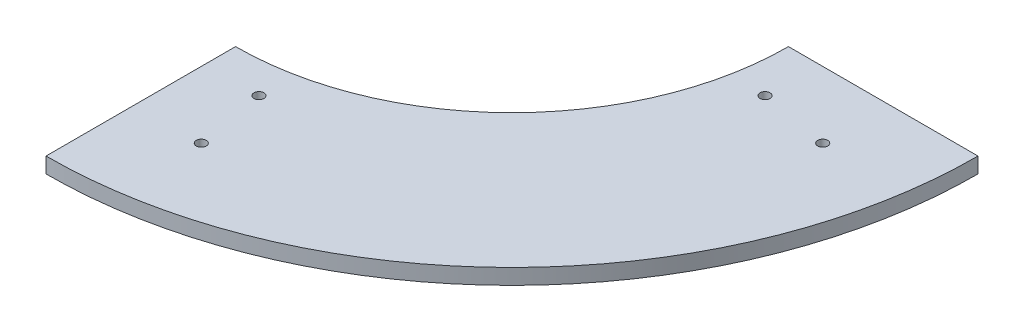
ISO-10303-21;
HEADER;
FILE_DESCRIPTION(('STEP AP214'),'2;1');
FILE_NAME('part.step','',(''),(''),'','','');
FILE_SCHEMA(('AUTOMOTIVE_DESIGN { 1 0 10303 214 1 1 1 1 }'));
ENDSEC;
DATA;
#1=APPLICATION_CONTEXT('core data for automotive mechanical design processes');
#2=APPLICATION_PROTOCOL_DEFINITION('international standard','automotive_design',2000,#1);
#3=PRODUCT_CONTEXT('',#1,'mechanical');
#4=PRODUCT('Part','Part','',(#3));
#5=PRODUCT_RELATED_PRODUCT_CATEGORY('part','',(#4));
#6=PRODUCT_DEFINITION_FORMATION('','',#4);
#7=PRODUCT_DEFINITION_CONTEXT('part definition',#1,'design');
#8=PRODUCT_DEFINITION('design','',#6,#7);
#9=PRODUCT_DEFINITION_SHAPE('','',#8);
#10=(LENGTH_UNIT() NAMED_UNIT(*) SI_UNIT(.MILLI.,.METRE.));
#11=(NAMED_UNIT(*) PLANE_ANGLE_UNIT() SI_UNIT($,.RADIAN.));
#12=(NAMED_UNIT(*) SI_UNIT($,.STERADIAN.) SOLID_ANGLE_UNIT());
#13=UNCERTAINTY_MEASURE_WITH_UNIT(LENGTH_MEASURE(1.E-05),#10,'distance_accuracy_value','');
#14=(GEOMETRIC_REPRESENTATION_CONTEXT(3) GLOBAL_UNCERTAINTY_ASSIGNED_CONTEXT((#13)) GLOBAL_UNIT_ASSIGNED_CONTEXT((#10,
#11,#12)) REPRESENTATION_CONTEXT('',''));
#15=CARTESIAN_POINT('',(0.,0.,0.));
#16=DIRECTION('',(0.,0.,1.));
#17=DIRECTION('',(1.,0.,0.));
#18=AXIS2_PLACEMENT_3D('',#15,#16,#17);
#19=CARTESIAN_POINT('',(0.,6.25,0.));
#20=DIRECTION('',(0.,-1.,0.));
#21=DIRECTION('',(0.,0.,-1.));
#22=AXIS2_PLACEMENT_3D('',#19,#20,#21);
#23=CYLINDRICAL_SURFACE('',#22,111.125);
#24=CARTESIAN_POINT('',(0.,0.,0.));
#25=DIRECTION('',(0.,-1.,0.));
#26=DIRECTION('',(0.,0.,1.));
#27=AXIS2_PLACEMENT_3D('',#24,#25,#26);
#28=CIRCLE('',#27,111.125);
#29=CARTESIAN_POINT('',(111.125,0.,0.));
#30=VERTEX_POINT('',#29);
#31=CARTESIAN_POINT('',(0.,0.,111.125));
#32=VERTEX_POINT('',#31);
#33=EDGE_CURVE('E109',#30,#32,#28,.T.);
#34=ORIENTED_EDGE('',*,*,#33,.T.);
#35=DIRECTION('',(0.,-1.,0.));
#36=VECTOR('',#35,1.);
#37=CARTESIAN_POINT('',(0.,6.25,111.125));
#38=LINE('',#37,#36);
#39=CARTESIAN_POINT('',(0.,6.25,111.125));
#40=VERTEX_POINT('',#39);
#41=EDGE_CURVE('E11',#40,#32,#38,.T.);
#42=ORIENTED_EDGE('',*,*,#41,.F.);
#43=CARTESIAN_POINT('',(0.,6.25,0.));
#44=DIRECTION('',(0.,-1.,0.));
#45=DIRECTION('',(0.,0.,1.));
#46=AXIS2_PLACEMENT_3D('',#43,#44,#45);
#47=CIRCLE('',#46,111.125);
#48=CARTESIAN_POINT('',(111.125,6.25,0.));
#49=VERTEX_POINT('',#48);
#50=EDGE_CURVE('E92',#49,#40,#47,.T.);
#51=ORIENTED_EDGE('',*,*,#50,.F.);
#52=DIRECTION('',(0.,-1.,0.));
#53=VECTOR('',#52,1.);
#54=CARTESIAN_POINT('',(111.125,6.25,0.));
#55=LINE('',#54,#53);
#56=EDGE_CURVE('E105',#49,#30,#55,.T.);
#57=ORIENTED_EDGE('',*,*,#56,.T.);
#58=EDGE_LOOP('',(#34,#42,#51,#57));
#59=FACE_BOUND('',#58,.T.);
#60=ADVANCED_FACE('F38',(#59),#23,.F.);
#61=CARTESIAN_POINT('',(0.,6.25,111.125));
#62=DIRECTION('',(1.,0.,0.));
#63=DIRECTION('',(0.,0.,-1.));
#64=AXIS2_PLACEMENT_3D('',#61,#62,#63);
#65=PLANE('',#64);
#66=DIRECTION('',(0.,0.,1.));
#67=VECTOR('',#66,1.);
#68=CARTESIAN_POINT('',(0.,0.,111.125));
#69=LINE('',#68,#67);
#70=CARTESIAN_POINT('',(0.,0.,187.325));
#71=VERTEX_POINT('',#70);
#72=EDGE_CURVE('E97',#32,#71,#69,.T.);
#73=ORIENTED_EDGE('',*,*,#72,.T.);
#74=DIRECTION('',(0.,-1.,0.));
#75=VECTOR('',#74,1.);
#76=CARTESIAN_POINT('',(0.,6.25,187.325));
#77=LINE('',#76,#75);
#78=CARTESIAN_POINT('',(0.,6.25,187.325));
#79=VERTEX_POINT('',#78);
#80=EDGE_CURVE('E48',#79,#71,#77,.T.);
#81=ORIENTED_EDGE('',*,*,#80,.F.);
#82=DIRECTION('',(0.,0.,1.));
#83=VECTOR('',#82,1.);
#84=CARTESIAN_POINT('',(0.,6.25,111.125));
#85=LINE('',#84,#83);
#86=EDGE_CURVE('E87',#40,#79,#85,.T.);
#87=ORIENTED_EDGE('',*,*,#86,.F.);
#88=ORIENTED_EDGE('',*,*,#41,.T.);
#89=EDGE_LOOP('',(#73,#81,#87,#88));
#90=FACE_BOUND('',#89,.T.);
#91=ADVANCED_FACE('F96',(#90),#65,.F.);
#92=CARTESIAN_POINT('',(0.,6.25,0.));
#93=DIRECTION('',(0.,-1.,0.));
#94=DIRECTION('',(0.,0.,-1.));
#95=AXIS2_PLACEMENT_3D('',#92,#93,#94);
#96=CYLINDRICAL_SURFACE('',#95,187.325);
#97=CARTESIAN_POINT('',(0.,0.,0.));
#98=DIRECTION('',(0.,1.,0.));
#99=DIRECTION('',(0.,0.,1.));
#100=AXIS2_PLACEMENT_3D('',#97,#98,#99);
#101=CIRCLE('',#100,187.325);
#102=CARTESIAN_POINT('',(187.325,0.,0.));
#103=VERTEX_POINT('',#102);
#104=EDGE_CURVE('E74',#71,#103,#101,.T.);
#105=ORIENTED_EDGE('',*,*,#104,.T.);
#106=DIRECTION('',(0.,-1.,0.));
#107=VECTOR('',#106,1.);
#108=CARTESIAN_POINT('',(187.325,6.25,0.));
#109=LINE('',#108,#107);
#110=CARTESIAN_POINT('',(187.325,6.25,0.));
#111=VERTEX_POINT('',#110);
#112=EDGE_CURVE('E99',#111,#103,#109,.T.);
#113=ORIENTED_EDGE('',*,*,#112,.F.);
#114=CARTESIAN_POINT('',(0.,6.25,0.));
#115=DIRECTION('',(0.,1.,0.));
#116=DIRECTION('',(0.,0.,1.));
#117=AXIS2_PLACEMENT_3D('',#114,#115,#116);
#118=CIRCLE('',#117,187.325);
#119=EDGE_CURVE('E90',#79,#111,#118,.T.);
#120=ORIENTED_EDGE('',*,*,#119,.F.);
#121=ORIENTED_EDGE('',*,*,#80,.T.);
#122=EDGE_LOOP('',(#105,#113,#120,#121));
#123=FACE_BOUND('',#122,.T.);
#124=ADVANCED_FACE('F101',(#123),#96,.T.);
#125=CARTESIAN_POINT('',(111.125,6.25,0.));
#126=DIRECTION('',(0.,0.,1.));
#127=DIRECTION('',(1.,0.,0.));
#128=AXIS2_PLACEMENT_3D('',#125,#126,#127);
#129=PLANE('',#128);
#130=DIRECTION('',(-1.,0.,0.));
#131=VECTOR('',#130,1.);
#132=CARTESIAN_POINT('',(111.125,0.,0.));
#133=LINE('',#132,#131);
#134=EDGE_CURVE('E80',#103,#30,#133,.T.);
#135=ORIENTED_EDGE('',*,*,#134,.T.);
#136=ORIENTED_EDGE('',*,*,#56,.F.);
#137=DIRECTION('',(-1.,0.,0.));
#138=VECTOR('',#137,1.);
#139=CARTESIAN_POINT('',(111.125,6.25,0.));
#140=LINE('',#139,#138);
#141=EDGE_CURVE('E57',#111,#49,#140,.T.);
#142=ORIENTED_EDGE('',*,*,#141,.F.);
#143=ORIENTED_EDGE('',*,*,#112,.T.);
#144=EDGE_LOOP('',(#135,#136,#142,#143));
#145=FACE_BOUND('',#144,.T.);
#146=ADVANCED_FACE('F171',(#145),#129,.F.);
#147=CARTESIAN_POINT('',(0.,6.25,0.));
#148=DIRECTION('',(0.,1.,0.));
#149=DIRECTION('',(0.,0.,1.));
#150=AXIS2_PLACEMENT_3D('',#147,#148,#149);
#151=PLANE('',#150);
#152=CARTESIAN_POINT('',(21.777652081654,6.25,123.507202324644));
#153=DIRECTION('',(0.,1.,0.));
#154=DIRECTION('',(0.,0.,1.));
#155=AXIS2_PLACEMENT_3D('',#152,#153,#154);
#156=CIRCLE('',#155,2.);
#157=CARTESIAN_POINT('',(21.777652081654,6.25,125.507202324644));
#158=VERTEX_POINT('',#157);
#159=EDGE_CURVE('E128',#158,#158,#156,.T.);
#160=ORIENTED_EDGE('',*,*,#159,.F.);
#161=EDGE_LOOP('',(#160));
#162=FACE_BOUND('',#161,.T.);
#163=CARTESIAN_POINT('',(123.507202324644,6.25,21.7776520816541));
#164=DIRECTION('',(0.,1.,0.));
#165=DIRECTION('',(0.,0.,-1.));
#166=AXIS2_PLACEMENT_3D('',#163,#164,#165);
#167=CIRCLE('',#166,2.);
#168=CARTESIAN_POINT('',(123.507202324644,6.25,19.7776520816541));
#169=VERTEX_POINT('',#168);
#170=EDGE_CURVE('E233',#169,#169,#167,.T.);
#171=ORIENTED_EDGE('',*,*,#170,.F.);
#172=EDGE_LOOP('',(#171));
#173=FACE_BOUND('',#172,.T.);
#174=CARTESIAN_POINT('',(26.7396487584866,6.25,151.648083866967));
#175=DIRECTION('',(0.,1.,0.));
#176=DIRECTION('',(0.,0.,1.));
#177=AXIS2_PLACEMENT_3D('',#174,#175,#176);
#178=CIRCLE('',#177,2.);
#179=CARTESIAN_POINT('',(26.7396487584866,6.25,153.648083866967));
#180=VERTEX_POINT('',#179);
#181=EDGE_CURVE('E225',#180,#180,#178,.T.);
#182=ORIENTED_EDGE('',*,*,#181,.F.);
#183=EDGE_LOOP('',(#182));
#184=FACE_BOUND('',#183,.T.);
#185=CARTESIAN_POINT('',(151.648083866967,6.25,26.7396487584867));
#186=DIRECTION('',(0.,1.,0.));
#187=DIRECTION('',(0.,0.,-1.));
#188=AXIS2_PLACEMENT_3D('',#185,#186,#187);
#189=CIRCLE('',#188,2.);
#190=CARTESIAN_POINT('',(151.648083866967,6.25,24.7396487584867));
#191=VERTEX_POINT('',#190);
#192=EDGE_CURVE('E234',#191,#191,#189,.T.);
#193=ORIENTED_EDGE('',*,*,#192,.F.);
#194=EDGE_LOOP('',(#193));
#195=FACE_BOUND('',#194,.T.);
#196=ORIENTED_EDGE('',*,*,#50,.T.);
#197=ORIENTED_EDGE('',*,*,#86,.T.);
#198=ORIENTED_EDGE('',*,*,#119,.T.);
#199=ORIENTED_EDGE('',*,*,#141,.T.);
#200=EDGE_LOOP('',(#196,#197,#198,#199));
#201=FACE_BOUND('',#200,.T.);
#202=ADVANCED_FACE('F88',(#162,#173,#184,#195,#201),#151,.T.);
#203=CARTESIAN_POINT('',(0.,0.,0.));
#204=DIRECTION('',(0.,1.,0.));
#205=DIRECTION('',(0.,0.,1.));
#206=AXIS2_PLACEMENT_3D('',#203,#204,#205);
#207=PLANE('',#206);
#208=CARTESIAN_POINT('',(21.777652081654,0.,123.507202324644));
#209=DIRECTION('',(0.,1.,0.));
#210=DIRECTION('',(0.,0.,1.));
#211=AXIS2_PLACEMENT_3D('',#208,#209,#210);
#212=CIRCLE('',#211,2.);
#213=CARTESIAN_POINT('',(21.777652081654,0.,125.507202324644));
#214=VERTEX_POINT('',#213);
#215=EDGE_CURVE('E41',#214,#214,#212,.T.);
#216=ORIENTED_EDGE('',*,*,#215,.T.);
#217=EDGE_LOOP('',(#216));
#218=FACE_BOUND('',#217,.T.);
#219=CARTESIAN_POINT('',(123.507202324644,0.,21.7776520816541));
#220=DIRECTION('',(0.,1.,0.));
#221=DIRECTION('',(0.,0.,1.));
#222=AXIS2_PLACEMENT_3D('',#219,#220,#221);
#223=CIRCLE('',#222,2.);
#224=CARTESIAN_POINT('',(123.507202324644,0.,23.7776520816541));
#225=VERTEX_POINT('',#224);
#226=EDGE_CURVE('E131',#225,#225,#223,.T.);
#227=ORIENTED_EDGE('',*,*,#226,.T.);
#228=EDGE_LOOP('',(#227));
#229=FACE_BOUND('',#228,.T.);
#230=CARTESIAN_POINT('',(26.7396487584866,0.,151.648083866967));
#231=DIRECTION('',(0.,1.,0.));
#232=DIRECTION('',(0.,0.,1.));
#233=AXIS2_PLACEMENT_3D('',#230,#231,#232);
#234=CIRCLE('',#233,2.);
#235=CARTESIAN_POINT('',(26.7396487584866,0.,153.648083866967));
#236=VERTEX_POINT('',#235);
#237=EDGE_CURVE('E127',#236,#236,#234,.T.);
#238=ORIENTED_EDGE('',*,*,#237,.T.);
#239=EDGE_LOOP('',(#238));
#240=FACE_BOUND('',#239,.T.);
#241=CARTESIAN_POINT('',(151.648083866967,0.,26.7396487584867));
#242=DIRECTION('',(0.,1.,0.));
#243=DIRECTION('',(0.,0.,1.));
#244=AXIS2_PLACEMENT_3D('',#241,#242,#243);
#245=CIRCLE('',#244,2.);
#246=CARTESIAN_POINT('',(151.648083866967,0.,28.7396487584867));
#247=VERTEX_POINT('',#246);
#248=EDGE_CURVE('E123',#247,#247,#245,.T.);
#249=ORIENTED_EDGE('',*,*,#248,.T.);
#250=EDGE_LOOP('',(#249));
#251=FACE_BOUND('',#250,.T.);
#252=ORIENTED_EDGE('',*,*,#33,.F.);
#253=ORIENTED_EDGE('',*,*,#134,.F.);
#254=ORIENTED_EDGE('',*,*,#104,.F.);
#255=ORIENTED_EDGE('',*,*,#72,.F.);
#256=EDGE_LOOP('',(#252,#253,#254,#255));
#257=FACE_BOUND('',#256,.T.);
#258=ADVANCED_FACE('F140',(#218,#229,#240,#251,#257),#207,.F.);
#259=CARTESIAN_POINT('',(151.648083866967,-0.0999999999999994,26.7396487584867));
#260=DIRECTION('',(0.,1.,0.));
#261=DIRECTION('',(0.,0.,1.));
#262=AXIS2_PLACEMENT_3D('',#259,#260,#261);
#263=CYLINDRICAL_SURFACE('',#262,2.);
#264=ORIENTED_EDGE('',*,*,#192,.T.);
#265=EDGE_LOOP('',(#264));
#266=FACE_BOUND('',#265,.T.);
#267=ORIENTED_EDGE('',*,*,#248,.F.);
#268=EDGE_LOOP('',(#267));
#269=FACE_BOUND('',#268,.T.);
#270=ADVANCED_FACE('F162',(#266,#269),#263,.F.);
#271=CARTESIAN_POINT('',(26.7396487584866,-0.0999999999999994,151.648083866967));
#272=DIRECTION('',(0.,1.,0.));
#273=DIRECTION('',(0.,0.,1.));
#274=AXIS2_PLACEMENT_3D('',#271,#272,#273);
#275=CYLINDRICAL_SURFACE('',#274,2.);
#276=ORIENTED_EDGE('',*,*,#181,.T.);
#277=EDGE_LOOP('',(#276));
#278=FACE_BOUND('',#277,.T.);
#279=ORIENTED_EDGE('',*,*,#237,.F.);
#280=EDGE_LOOP('',(#279));
#281=FACE_BOUND('',#280,.T.);
#282=ADVANCED_FACE('F150',(#278,#281),#275,.F.);
#283=CARTESIAN_POINT('',(123.507202324644,-0.0999999999999994,21.7776520816541));
#284=DIRECTION('',(0.,1.,0.));
#285=DIRECTION('',(0.,0.,1.));
#286=AXIS2_PLACEMENT_3D('',#283,#284,#285);
#287=CYLINDRICAL_SURFACE('',#286,2.);
#288=ORIENTED_EDGE('',*,*,#170,.T.);
#289=EDGE_LOOP('',(#288));
#290=FACE_BOUND('',#289,.T.);
#291=ORIENTED_EDGE('',*,*,#226,.F.);
#292=EDGE_LOOP('',(#291));
#293=FACE_BOUND('',#292,.T.);
#294=ADVANCED_FACE('F144',(#290,#293),#287,.F.);
#295=CARTESIAN_POINT('',(21.777652081654,-0.0999999999999994,123.507202324644));
#296=DIRECTION('',(0.,1.,0.));
#297=DIRECTION('',(0.,0.,1.));
#298=AXIS2_PLACEMENT_3D('',#295,#296,#297);
#299=CYLINDRICAL_SURFACE('',#298,2.);
#300=ORIENTED_EDGE('',*,*,#159,.T.);
#301=EDGE_LOOP('',(#300));
#302=FACE_BOUND('',#301,.T.);
#303=ORIENTED_EDGE('',*,*,#215,.F.);
#304=EDGE_LOOP('',(#303));
#305=FACE_BOUND('',#304,.T.);
#306=ADVANCED_FACE('F142',(#302,#305),#299,.F.);
#307=CLOSED_SHELL('',(#60,#91,#124,#146,#202,#258,#270,#282,#294,#306));
#308=MANIFOLD_SOLID_BREP('B2',#307);
#309=ADVANCED_BREP_SHAPE_REPRESENTATION('',(#18,#308),#14);
#310=SHAPE_DEFINITION_REPRESENTATION(#9,#309);
ENDSEC;
END-ISO-10303-21;
